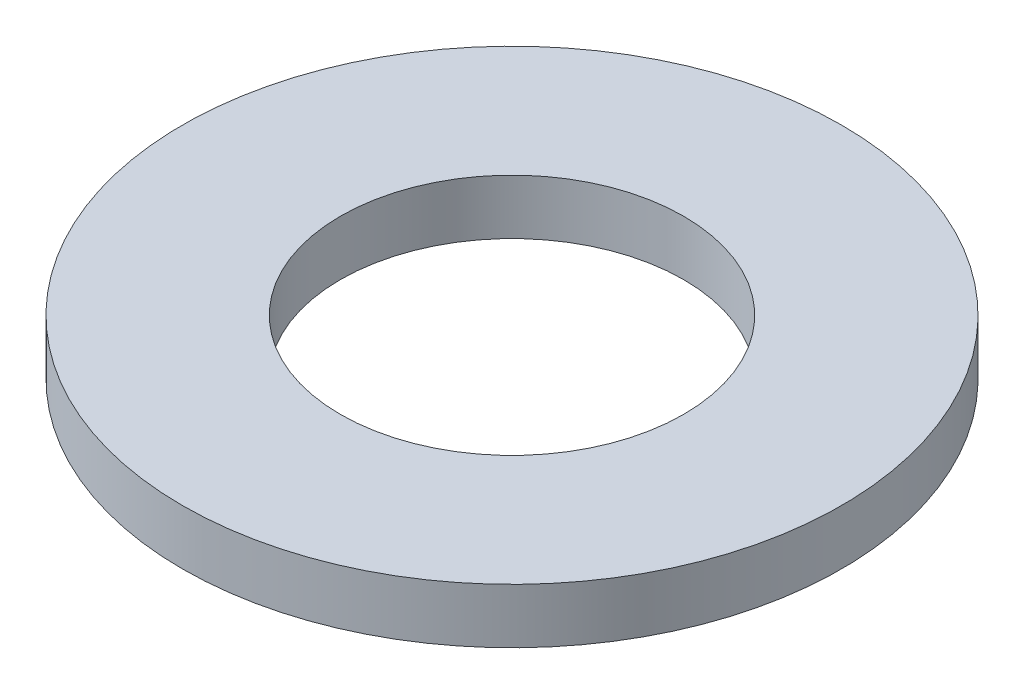
ISO-10303-21;
HEADER;
FILE_DESCRIPTION(('STEP AP214'),'2;1');
FILE_NAME('part.step','',(''),(''),'','','');
FILE_SCHEMA(('AUTOMOTIVE_DESIGN { 1 0 10303 214 1 1 1 1 }'));
ENDSEC;
DATA;
#1=APPLICATION_CONTEXT('core data for automotive mechanical design processes');
#2=APPLICATION_PROTOCOL_DEFINITION('international standard','automotive_design',2000,#1);
#3=PRODUCT_CONTEXT('',#1,'mechanical');
#4=PRODUCT('Part','Part','',(#3));
#5=PRODUCT_RELATED_PRODUCT_CATEGORY('part','',(#4));
#6=PRODUCT_DEFINITION_FORMATION('','',#4);
#7=PRODUCT_DEFINITION_CONTEXT('part definition',#1,'design');
#8=PRODUCT_DEFINITION('design','',#6,#7);
#9=PRODUCT_DEFINITION_SHAPE('','',#8);
#10=(LENGTH_UNIT() NAMED_UNIT(*) SI_UNIT(.MILLI.,.METRE.));
#11=(NAMED_UNIT(*) PLANE_ANGLE_UNIT() SI_UNIT($,.RADIAN.));
#12=(NAMED_UNIT(*) SI_UNIT($,.STERADIAN.) SOLID_ANGLE_UNIT());
#13=UNCERTAINTY_MEASURE_WITH_UNIT(LENGTH_MEASURE(1.E-05),#10,'distance_accuracy_value','');
#14=(GEOMETRIC_REPRESENTATION_CONTEXT(3) GLOBAL_UNCERTAINTY_ASSIGNED_CONTEXT((#13)) GLOBAL_UNIT_ASSIGNED_CONTEXT((#10,
#11,#12)) REPRESENTATION_CONTEXT('',''));
#15=CARTESIAN_POINT('',(0.,0.,0.));
#16=DIRECTION('',(0.,0.,1.));
#17=DIRECTION('',(1.,0.,0.));
#18=AXIS2_PLACEMENT_3D('',#15,#16,#17);
#19=CARTESIAN_POINT('',(0.,1.,0.));
#20=DIRECTION('',(0.,1.,0.));
#21=DIRECTION('',(0.,0.,1.));
#22=AXIS2_PLACEMENT_3D('',#19,#20,#21);
#23=PLANE('',#22);
#24=CARTESIAN_POINT('',(0.,1.,0.));
#25=DIRECTION('',(0.,1.,0.));
#26=DIRECTION('',(0.,0.,1.));
#27=AXIS2_PLACEMENT_3D('',#24,#25,#26);
#28=CIRCLE('',#27,6.);
#29=CARTESIAN_POINT('',(0.,1.,6.));
#30=VERTEX_POINT('',#29);
#31=EDGE_CURVE('E10',#30,#30,#28,.T.);
#32=ORIENTED_EDGE('',*,*,#31,.T.);
#33=EDGE_LOOP('',(#32));
#34=FACE_BOUND('',#33,.T.);
#35=CARTESIAN_POINT('',(0.,1.,0.));
#36=DIRECTION('',(0.,1.,0.));
#37=DIRECTION('',(0.,0.,1.));
#38=AXIS2_PLACEMENT_3D('',#35,#36,#37);
#39=CIRCLE('',#38,3.125);
#40=CARTESIAN_POINT('',(0.,1.,3.125));
#41=VERTEX_POINT('',#40);
#42=EDGE_CURVE('E48',#41,#41,#39,.T.);
#43=ORIENTED_EDGE('',*,*,#42,.F.);
#44=EDGE_LOOP('',(#43));
#45=FACE_BOUND('',#44,.T.);
#46=ADVANCED_FACE('F37',(#34,#45),#23,.T.);
#47=CARTESIAN_POINT('',(0.,0.,0.));
#48=DIRECTION('',(0.,1.,0.));
#49=DIRECTION('',(0.,0.,1.));
#50=AXIS2_PLACEMENT_3D('',#47,#48,#49);
#51=PLANE('',#50);
#52=CARTESIAN_POINT('',(0.,0.,0.));
#53=DIRECTION('',(0.,1.,0.));
#54=DIRECTION('',(0.,0.,1.));
#55=AXIS2_PLACEMENT_3D('',#52,#53,#54);
#56=CIRCLE('',#55,6.);
#57=CARTESIAN_POINT('',(0.,0.,6.));
#58=VERTEX_POINT('',#57);
#59=EDGE_CURVE('E41',#58,#58,#56,.T.);
#60=ORIENTED_EDGE('',*,*,#59,.F.);
#61=EDGE_LOOP('',(#60));
#62=FACE_BOUND('',#61,.T.);
#63=CARTESIAN_POINT('',(0.,0.,0.));
#64=DIRECTION('',(0.,1.,0.));
#65=DIRECTION('',(0.,0.,1.));
#66=AXIS2_PLACEMENT_3D('',#63,#64,#65);
#67=CIRCLE('',#66,3.125);
#68=CARTESIAN_POINT('',(0.,0.,3.125));
#69=VERTEX_POINT('',#68);
#70=EDGE_CURVE('E50',#69,#69,#67,.T.);
#71=ORIENTED_EDGE('',*,*,#70,.T.);
#72=EDGE_LOOP('',(#71));
#73=FACE_BOUND('',#72,.T.);
#74=ADVANCED_FACE('F60',(#62,#73),#51,.F.);
#75=CARTESIAN_POINT('',(0.,1.,0.));
#76=DIRECTION('',(0.,-1.,0.));
#77=DIRECTION('',(0.,0.,-1.));
#78=AXIS2_PLACEMENT_3D('',#75,#76,#77);
#79=CYLINDRICAL_SURFACE('',#78,6.);
#80=ORIENTED_EDGE('',*,*,#31,.F.);
#81=EDGE_LOOP('',(#80));
#82=FACE_BOUND('',#81,.T.);
#83=ORIENTED_EDGE('',*,*,#59,.T.);
#84=EDGE_LOOP('',(#83));
#85=FACE_BOUND('',#84,.T.);
#86=ADVANCED_FACE('F39',(#82,#85),#79,.T.);
#87=CARTESIAN_POINT('',(0.,1.,0.));
#88=DIRECTION('',(0.,-1.,0.));
#89=DIRECTION('',(0.,0.,-1.));
#90=AXIS2_PLACEMENT_3D('',#87,#88,#89);
#91=CYLINDRICAL_SURFACE('',#90,3.125);
#92=ORIENTED_EDGE('',*,*,#42,.T.);
#93=EDGE_LOOP('',(#92));
#94=FACE_BOUND('',#93,.T.);
#95=ORIENTED_EDGE('',*,*,#70,.F.);
#96=EDGE_LOOP('',(#95));
#97=FACE_BOUND('',#96,.T.);
#98=ADVANCED_FACE('F56',(#94,#97),#91,.F.);
#99=CLOSED_SHELL('',(#46,#74,#86,#98));
#100=MANIFOLD_SOLID_BREP('B2',#99);
#101=ADVANCED_BREP_SHAPE_REPRESENTATION('',(#18,#100),#14);
#102=SHAPE_DEFINITION_REPRESENTATION(#9,#101);
ENDSEC;
END-ISO-10303-21;
